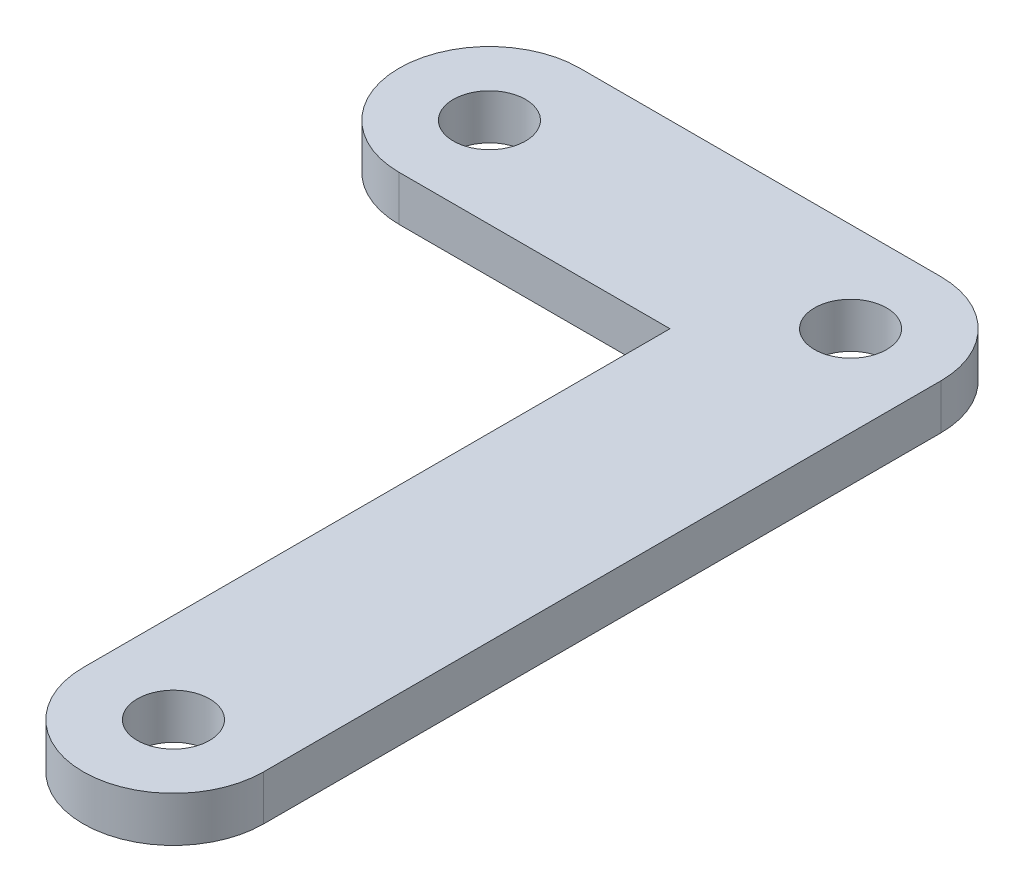
ISO-10303-21;
HEADER;
FILE_DESCRIPTION(('STEP AP214'),'2;1');
FILE_NAME('part.step','',(''),(''),'','','');
FILE_SCHEMA(('AUTOMOTIVE_DESIGN { 1 0 10303 214 1 1 1 1 }'));
ENDSEC;
DATA;
#1=APPLICATION_CONTEXT('core data for automotive mechanical design processes');
#2=APPLICATION_PROTOCOL_DEFINITION('international standard','automotive_design',2000,#1);
#3=PRODUCT_CONTEXT('',#1,'mechanical');
#4=PRODUCT('Part','Part','',(#3));
#5=PRODUCT_RELATED_PRODUCT_CATEGORY('part','',(#4));
#6=PRODUCT_DEFINITION_FORMATION('','',#4);
#7=PRODUCT_DEFINITION_CONTEXT('part definition',#1,'design');
#8=PRODUCT_DEFINITION('design','',#6,#7);
#9=PRODUCT_DEFINITION_SHAPE('','',#8);
#10=(LENGTH_UNIT() NAMED_UNIT(*) SI_UNIT(.MILLI.,.METRE.));
#11=(NAMED_UNIT(*) PLANE_ANGLE_UNIT() SI_UNIT($,.RADIAN.));
#12=(NAMED_UNIT(*) SI_UNIT($,.STERADIAN.) SOLID_ANGLE_UNIT());
#13=UNCERTAINTY_MEASURE_WITH_UNIT(LENGTH_MEASURE(1.E-05),#10,'distance_accuracy_value','');
#14=(GEOMETRIC_REPRESENTATION_CONTEXT(3) GLOBAL_UNCERTAINTY_ASSIGNED_CONTEXT((#13)) GLOBAL_UNIT_ASSIGNED_CONTEXT((#10,
#11,#12)) REPRESENTATION_CONTEXT('',''));
#15=CARTESIAN_POINT('',(0.,0.,0.));
#16=DIRECTION('',(0.,0.,1.));
#17=DIRECTION('',(1.,0.,0.));
#18=AXIS2_PLACEMENT_3D('',#15,#16,#17);
#19=CARTESIAN_POINT('',(-40.,5.,-75.));
#20=DIRECTION('',(0.,-1.,0.));
#21=DIRECTION('',(0.,0.,-1.));
#22=AXIS2_PLACEMENT_3D('',#19,#20,#21);
#23=CYLINDRICAL_SURFACE('',#22,9.99999999999999);
#24=CARTESIAN_POINT('',(-40.,0.,-75.));
#25=DIRECTION('',(0.,1.,0.));
#26=DIRECTION('',(0.,0.,1.));
#27=AXIS2_PLACEMENT_3D('',#24,#25,#26);
#28=CIRCLE('',#27,9.99999999999999);
#29=CARTESIAN_POINT('',(-40.,0.,-85.));
#30=VERTEX_POINT('',#29);
#31=CARTESIAN_POINT('',(-40.,0.,-65.));
#32=VERTEX_POINT('',#31);
#33=EDGE_CURVE('E127',#30,#32,#28,.T.);
#34=ORIENTED_EDGE('',*,*,#33,.T.);
#35=DIRECTION('',(0.,-1.,0.));
#36=VECTOR('',#35,1.);
#37=CARTESIAN_POINT('',(-40.,5.,-65.));
#38=LINE('',#37,#36);
#39=CARTESIAN_POINT('',(-40.,5.,-65.));
#40=VERTEX_POINT('',#39);
#41=EDGE_CURVE('E11',#40,#32,#38,.T.);
#42=ORIENTED_EDGE('',*,*,#41,.F.);
#43=CARTESIAN_POINT('',(-40.,5.,-75.));
#44=DIRECTION('',(0.,1.,0.));
#45=DIRECTION('',(0.,0.,1.));
#46=AXIS2_PLACEMENT_3D('',#43,#44,#45);
#47=CIRCLE('',#46,9.99999999999999);
#48=CARTESIAN_POINT('',(-40.,5.,-85.));
#49=VERTEX_POINT('',#48);
#50=EDGE_CURVE('E140',#49,#40,#47,.T.);
#51=ORIENTED_EDGE('',*,*,#50,.F.);
#52=DIRECTION('',(0.,-1.,0.));
#53=VECTOR('',#52,1.);
#54=CARTESIAN_POINT('',(-40.,5.,-85.));
#55=LINE('',#54,#53);
#56=EDGE_CURVE('E123',#49,#30,#55,.T.);
#57=ORIENTED_EDGE('',*,*,#56,.T.);
#58=EDGE_LOOP('',(#34,#42,#51,#57));
#59=FACE_BOUND('',#58,.T.);
#60=ADVANCED_FACE('F37',(#59),#23,.T.);
#61=CARTESIAN_POINT('',(-40.,5.,-65.));
#62=DIRECTION('',(0.,0.,-1.));
#63=DIRECTION('',(-1.,0.,0.));
#64=AXIS2_PLACEMENT_3D('',#61,#62,#63);
#65=PLANE('',#64);
#66=DIRECTION('',(1.,0.,0.));
#67=VECTOR('',#66,1.);
#68=CARTESIAN_POINT('',(-40.,0.,-65.));
#69=LINE('',#68,#67);
#70=CARTESIAN_POINT('',(-10.,0.,-65.));
#71=VERTEX_POINT('',#70);
#72=EDGE_CURVE('E130',#32,#71,#69,.T.);
#73=ORIENTED_EDGE('',*,*,#72,.T.);
#74=DIRECTION('',(0.,-1.,0.));
#75=VECTOR('',#74,1.);
#76=CARTESIAN_POINT('',(-10.,5.,-65.));
#77=LINE('',#76,#75);
#78=CARTESIAN_POINT('',(-10.,5.,-65.));
#79=VERTEX_POINT('',#78);
#80=EDGE_CURVE('E45',#79,#71,#77,.T.);
#81=ORIENTED_EDGE('',*,*,#80,.F.);
#82=DIRECTION('',(1.,0.,0.));
#83=VECTOR('',#82,1.);
#84=CARTESIAN_POINT('',(-40.,5.,-65.));
#85=LINE('',#84,#83);
#86=EDGE_CURVE('E93',#40,#79,#85,.T.);
#87=ORIENTED_EDGE('',*,*,#86,.F.);
#88=ORIENTED_EDGE('',*,*,#41,.T.);
#89=EDGE_LOOP('',(#73,#81,#87,#88));
#90=FACE_BOUND('',#89,.T.);
#91=ADVANCED_FACE('F209',(#90),#65,.F.);
#92=CARTESIAN_POINT('',(-10.,5.,0.));
#93=DIRECTION('',(1.,0.,0.));
#94=DIRECTION('',(0.,0.,-1.));
#95=AXIS2_PLACEMENT_3D('',#92,#93,#94);
#96=PLANE('',#95);
#97=DIRECTION('',(0.,0.,1.));
#98=VECTOR('',#97,1.);
#99=CARTESIAN_POINT('',(-10.,0.,0.));
#100=LINE('',#99,#98);
#101=CARTESIAN_POINT('',(-10.,0.,0.));
#102=VERTEX_POINT('',#101);
#103=EDGE_CURVE('E133',#71,#102,#100,.T.);
#104=ORIENTED_EDGE('',*,*,#103,.T.);
#105=DIRECTION('',(0.,-1.,0.));
#106=VECTOR('',#105,1.);
#107=CARTESIAN_POINT('',(-10.,5.,0.));
#108=LINE('',#107,#106);
#109=CARTESIAN_POINT('',(-10.,5.,0.));
#110=VERTEX_POINT('',#109);
#111=EDGE_CURVE('E144',#110,#102,#108,.T.);
#112=ORIENTED_EDGE('',*,*,#111,.F.);
#113=DIRECTION('',(0.,0.,1.));
#114=VECTOR('',#113,1.);
#115=CARTESIAN_POINT('',(-10.,5.,0.));
#116=LINE('',#115,#114);
#117=EDGE_CURVE('E152',#79,#110,#116,.T.);
#118=ORIENTED_EDGE('',*,*,#117,.F.);
#119=ORIENTED_EDGE('',*,*,#80,.T.);
#120=EDGE_LOOP('',(#104,#112,#118,#119));
#121=FACE_BOUND('',#120,.T.);
#122=ADVANCED_FACE('F150',(#121),#96,.F.);
#123=CARTESIAN_POINT('',(0.,5.,0.));
#124=DIRECTION('',(0.,-1.,0.));
#125=DIRECTION('',(0.,0.,-1.));
#126=AXIS2_PLACEMENT_3D('',#123,#124,#125);
#127=CYLINDRICAL_SURFACE('',#126,10.);
#128=CARTESIAN_POINT('',(0.,0.,0.));
#129=DIRECTION('',(0.,1.,0.));
#130=DIRECTION('',(0.,0.,1.));
#131=AXIS2_PLACEMENT_3D('',#128,#129,#130);
#132=CIRCLE('',#131,10.);
#133=CARTESIAN_POINT('',(10.,0.,0.));
#134=VERTEX_POINT('',#133);
#135=EDGE_CURVE('E135',#102,#134,#132,.T.);
#136=ORIENTED_EDGE('',*,*,#135,.T.);
#137=DIRECTION('',(0.,-1.,0.));
#138=VECTOR('',#137,1.);
#139=CARTESIAN_POINT('',(10.,5.,0.));
#140=LINE('',#139,#138);
#141=CARTESIAN_POINT('',(10.,5.,0.));
#142=VERTEX_POINT('',#141);
#143=EDGE_CURVE('E118',#142,#134,#140,.T.);
#144=ORIENTED_EDGE('',*,*,#143,.F.);
#145=CARTESIAN_POINT('',(0.,5.,0.));
#146=DIRECTION('',(0.,1.,0.));
#147=DIRECTION('',(0.,0.,1.));
#148=AXIS2_PLACEMENT_3D('',#145,#146,#147);
#149=CIRCLE('',#148,10.);
#150=EDGE_CURVE('E109',#110,#142,#149,.T.);
#151=ORIENTED_EDGE('',*,*,#150,.F.);
#152=ORIENTED_EDGE('',*,*,#111,.T.);
#153=EDGE_LOOP('',(#136,#144,#151,#152));
#154=FACE_BOUND('',#153,.T.);
#155=ADVANCED_FACE('F158',(#154),#127,.T.);
#156=CARTESIAN_POINT('',(10.,5.,-75.));
#157=DIRECTION('',(-1.,0.,0.));
#158=DIRECTION('',(0.,0.,1.));
#159=AXIS2_PLACEMENT_3D('',#156,#157,#158);
#160=PLANE('',#159);
#161=DIRECTION('',(0.,0.,-1.));
#162=VECTOR('',#161,1.);
#163=CARTESIAN_POINT('',(10.,0.,-75.));
#164=LINE('',#163,#162);
#165=CARTESIAN_POINT('',(10.,0.,-75.));
#166=VERTEX_POINT('',#165);
#167=EDGE_CURVE('E117',#134,#166,#164,.T.);
#168=ORIENTED_EDGE('',*,*,#167,.T.);
#169=DIRECTION('',(0.,-1.,0.));
#170=VECTOR('',#169,1.);
#171=CARTESIAN_POINT('',(10.,5.,-75.));
#172=LINE('',#171,#170);
#173=CARTESIAN_POINT('',(10.,5.,-75.));
#174=VERTEX_POINT('',#173);
#175=EDGE_CURVE('E114',#174,#166,#172,.T.);
#176=ORIENTED_EDGE('',*,*,#175,.F.);
#177=DIRECTION('',(0.,0.,-1.));
#178=VECTOR('',#177,1.);
#179=CARTESIAN_POINT('',(10.,5.,-75.));
#180=LINE('',#179,#178);
#181=EDGE_CURVE('E103',#142,#174,#180,.T.);
#182=ORIENTED_EDGE('',*,*,#181,.F.);
#183=ORIENTED_EDGE('',*,*,#143,.T.);
#184=EDGE_LOOP('',(#168,#176,#182,#183));
#185=FACE_BOUND('',#184,.T.);
#186=ADVANCED_FACE('F115',(#185),#160,.F.);
#187=CARTESIAN_POINT('',(0.,5.,-75.));
#188=DIRECTION('',(0.,-1.,0.));
#189=DIRECTION('',(0.,0.,-1.));
#190=AXIS2_PLACEMENT_3D('',#187,#188,#189);
#191=CYLINDRICAL_SURFACE('',#190,10.);
#192=CARTESIAN_POINT('',(0.,0.,-75.));
#193=DIRECTION('',(0.,1.,0.));
#194=DIRECTION('',(0.,0.,-1.));
#195=AXIS2_PLACEMENT_3D('',#192,#193,#194);
#196=CIRCLE('',#195,10.);
#197=CARTESIAN_POINT('',(0.,0.,-85.));
#198=VERTEX_POINT('',#197);
#199=EDGE_CURVE('E79',#166,#198,#196,.T.);
#200=ORIENTED_EDGE('',*,*,#199,.T.);
#201=DIRECTION('',(0.,-1.,0.));
#202=VECTOR('',#201,1.);
#203=CARTESIAN_POINT('',(0.,5.,-85.));
#204=LINE('',#203,#202);
#205=CARTESIAN_POINT('',(0.,5.,-85.));
#206=VERTEX_POINT('',#205);
#207=EDGE_CURVE('E119',#206,#198,#204,.T.);
#208=ORIENTED_EDGE('',*,*,#207,.F.);
#209=CARTESIAN_POINT('',(0.,5.,-75.));
#210=DIRECTION('',(0.,1.,0.));
#211=DIRECTION('',(0.,0.,-1.));
#212=AXIS2_PLACEMENT_3D('',#209,#210,#211);
#213=CIRCLE('',#212,10.);
#214=EDGE_CURVE('E107',#174,#206,#213,.T.);
#215=ORIENTED_EDGE('',*,*,#214,.F.);
#216=ORIENTED_EDGE('',*,*,#175,.T.);
#217=EDGE_LOOP('',(#200,#208,#215,#216));
#218=FACE_BOUND('',#217,.T.);
#219=ADVANCED_FACE('F121',(#218),#191,.T.);
#220=CARTESIAN_POINT('',(-40.,5.,-85.));
#221=DIRECTION('',(0.,0.,1.));
#222=DIRECTION('',(1.,0.,0.));
#223=AXIS2_PLACEMENT_3D('',#220,#221,#222);
#224=PLANE('',#223);
#225=DIRECTION('',(-1.,0.,0.));
#226=VECTOR('',#225,1.);
#227=CARTESIAN_POINT('',(-40.,0.,-85.));
#228=LINE('',#227,#226);
#229=EDGE_CURVE('E85',#198,#30,#228,.T.);
#230=ORIENTED_EDGE('',*,*,#229,.T.);
#231=ORIENTED_EDGE('',*,*,#56,.F.);
#232=DIRECTION('',(-1.,0.,0.));
#233=VECTOR('',#232,1.);
#234=CARTESIAN_POINT('',(-40.,5.,-85.));
#235=LINE('',#234,#233);
#236=EDGE_CURVE('E53',#206,#49,#235,.T.);
#237=ORIENTED_EDGE('',*,*,#236,.F.);
#238=ORIENTED_EDGE('',*,*,#207,.T.);
#239=EDGE_LOOP('',(#230,#231,#237,#238));
#240=FACE_BOUND('',#239,.T.);
#241=ADVANCED_FACE('F216',(#240),#224,.F.);
#242=CARTESIAN_POINT('',(-40.,5.,-75.));
#243=DIRECTION('',(0.,1.,0.));
#244=DIRECTION('',(0.,0.,1.));
#245=AXIS2_PLACEMENT_3D('',#242,#243,#244);
#246=PLANE('',#245);
#247=CARTESIAN_POINT('',(0.,5.,0.));
#248=DIRECTION('',(0.,-1.,0.));
#249=DIRECTION('',(0.,0.,-1.));
#250=AXIS2_PLACEMENT_3D('',#247,#248,#249);
#251=CIRCLE('',#250,4.);
#252=CARTESIAN_POINT('',(0.,5.,-4.));
#253=VERTEX_POINT('',#252);
#254=EDGE_CURVE('E131',#253,#253,#251,.T.);
#255=ORIENTED_EDGE('',*,*,#254,.T.);
#256=EDGE_LOOP('',(#255));
#257=FACE_BOUND('',#256,.T.);
#258=CARTESIAN_POINT('',(-40.,5.,-75.));
#259=DIRECTION('',(0.,-1.,0.));
#260=DIRECTION('',(0.,0.,-1.));
#261=AXIS2_PLACEMENT_3D('',#258,#259,#260);
#262=CIRCLE('',#261,4.00000000000001);
#263=CARTESIAN_POINT('',(-40.,5.,-79.));
#264=VERTEX_POINT('',#263);
#265=EDGE_CURVE('E169',#264,#264,#262,.T.);
#266=ORIENTED_EDGE('',*,*,#265,.T.);
#267=EDGE_LOOP('',(#266));
#268=FACE_BOUND('',#267,.T.);
#269=CARTESIAN_POINT('',(0.,5.,-75.));
#270=DIRECTION('',(0.,-1.,0.));
#271=DIRECTION('',(0.,0.,-1.));
#272=AXIS2_PLACEMENT_3D('',#269,#270,#271);
#273=CIRCLE('',#272,4.);
#274=CARTESIAN_POINT('',(0.,5.,-79.));
#275=VERTEX_POINT('',#274);
#276=EDGE_CURVE('E163',#275,#275,#273,.T.);
#277=ORIENTED_EDGE('',*,*,#276,.T.);
#278=EDGE_LOOP('',(#277));
#279=FACE_BOUND('',#278,.T.);
#280=ORIENTED_EDGE('',*,*,#50,.T.);
#281=ORIENTED_EDGE('',*,*,#86,.T.);
#282=ORIENTED_EDGE('',*,*,#117,.T.);
#283=ORIENTED_EDGE('',*,*,#150,.T.);
#284=ORIENTED_EDGE('',*,*,#181,.T.);
#285=ORIENTED_EDGE('',*,*,#214,.T.);
#286=ORIENTED_EDGE('',*,*,#236,.T.);
#287=EDGE_LOOP('',(#280,#281,#282,#283,#284,#285,#286));
#288=FACE_BOUND('',#287,.T.);
#289=ADVANCED_FACE('F105',(#257,#268,#279,#288),#246,.T.);
#290=CARTESIAN_POINT('',(-40.,0.,-75.));
#291=DIRECTION('',(0.,1.,0.));
#292=DIRECTION('',(0.,0.,1.));
#293=AXIS2_PLACEMENT_3D('',#290,#291,#292);
#294=PLANE('',#293);
#295=CARTESIAN_POINT('',(0.,0.,0.));
#296=DIRECTION('',(0.,-1.,0.));
#297=DIRECTION('',(0.,0.,-1.));
#298=AXIS2_PLACEMENT_3D('',#295,#296,#297);
#299=CIRCLE('',#298,4.);
#300=CARTESIAN_POINT('',(0.,0.,-4.));
#301=VERTEX_POINT('',#300);
#302=EDGE_CURVE('E175',#301,#301,#299,.T.);
#303=ORIENTED_EDGE('',*,*,#302,.F.);
#304=EDGE_LOOP('',(#303));
#305=FACE_BOUND('',#304,.T.);
#306=CARTESIAN_POINT('',(-40.,0.,-75.));
#307=DIRECTION('',(0.,-1.,0.));
#308=DIRECTION('',(0.,0.,-1.));
#309=AXIS2_PLACEMENT_3D('',#306,#307,#308);
#310=CIRCLE('',#309,4.00000000000001);
#311=CARTESIAN_POINT('',(-40.,0.,-79.));
#312=VERTEX_POINT('',#311);
#313=EDGE_CURVE('E172',#312,#312,#310,.T.);
#314=ORIENTED_EDGE('',*,*,#313,.F.);
#315=EDGE_LOOP('',(#314));
#316=FACE_BOUND('',#315,.T.);
#317=CARTESIAN_POINT('',(0.,0.,-75.));
#318=DIRECTION('',(0.,-1.,0.));
#319=DIRECTION('',(0.,0.,-1.));
#320=AXIS2_PLACEMENT_3D('',#317,#318,#319);
#321=CIRCLE('',#320,4.);
#322=CARTESIAN_POINT('',(0.,0.,-79.));
#323=VERTEX_POINT('',#322);
#324=EDGE_CURVE('E166',#323,#323,#321,.T.);
#325=ORIENTED_EDGE('',*,*,#324,.F.);
#326=EDGE_LOOP('',(#325));
#327=FACE_BOUND('',#326,.T.);
#328=ORIENTED_EDGE('',*,*,#33,.F.);
#329=ORIENTED_EDGE('',*,*,#229,.F.);
#330=ORIENTED_EDGE('',*,*,#199,.F.);
#331=ORIENTED_EDGE('',*,*,#167,.F.);
#332=ORIENTED_EDGE('',*,*,#135,.F.);
#333=ORIENTED_EDGE('',*,*,#103,.F.);
#334=ORIENTED_EDGE('',*,*,#72,.F.);
#335=EDGE_LOOP('',(#328,#329,#330,#331,#332,#333,#334));
#336=FACE_BOUND('',#335,.T.);
#337=ADVANCED_FACE('F156',(#305,#316,#327,#336),#294,.F.);
#338=CARTESIAN_POINT('',(0.,5.,-75.));
#339=DIRECTION('',(0.,-1.,0.));
#340=DIRECTION('',(0.,0.,-1.));
#341=AXIS2_PLACEMENT_3D('',#338,#339,#340);
#342=CYLINDRICAL_SURFACE('',#341,4.);
#343=ORIENTED_EDGE('',*,*,#276,.F.);
#344=EDGE_LOOP('',(#343));
#345=FACE_BOUND('',#344,.T.);
#346=ORIENTED_EDGE('',*,*,#324,.T.);
#347=EDGE_LOOP('',(#346));
#348=FACE_BOUND('',#347,.T.);
#349=ADVANCED_FACE('F192',(#345,#348),#342,.F.);
#350=CARTESIAN_POINT('',(-40.,5.,-75.));
#351=DIRECTION('',(0.,-1.,0.));
#352=DIRECTION('',(0.,0.,-1.));
#353=AXIS2_PLACEMENT_3D('',#350,#351,#352);
#354=CYLINDRICAL_SURFACE('',#353,4.00000000000001);
#355=ORIENTED_EDGE('',*,*,#265,.F.);
#356=EDGE_LOOP('',(#355));
#357=FACE_BOUND('',#356,.T.);
#358=ORIENTED_EDGE('',*,*,#313,.T.);
#359=EDGE_LOOP('',(#358));
#360=FACE_BOUND('',#359,.T.);
#361=ADVANCED_FACE('F186',(#357,#360),#354,.F.);
#362=CARTESIAN_POINT('',(0.,5.,0.));
#363=DIRECTION('',(0.,-1.,0.));
#364=DIRECTION('',(0.,0.,-1.));
#365=AXIS2_PLACEMENT_3D('',#362,#363,#364);
#366=CYLINDRICAL_SURFACE('',#365,4.);
#367=ORIENTED_EDGE('',*,*,#254,.F.);
#368=EDGE_LOOP('',(#367));
#369=FACE_BOUND('',#368,.T.);
#370=ORIENTED_EDGE('',*,*,#302,.T.);
#371=EDGE_LOOP('',(#370));
#372=FACE_BOUND('',#371,.T.);
#373=ADVANCED_FACE('F183',(#369,#372),#366,.F.);
#374=CLOSED_SHELL('',(#60,#91,#122,#155,#186,#219,#241,#289,#337,#349,#361,#373));
#375=MANIFOLD_SOLID_BREP('B2',#374);
#376=ADVANCED_BREP_SHAPE_REPRESENTATION('',(#18,#375),#14);
#377=SHAPE_DEFINITION_REPRESENTATION(#9,#376);
ENDSEC;
END-ISO-10303-21;
